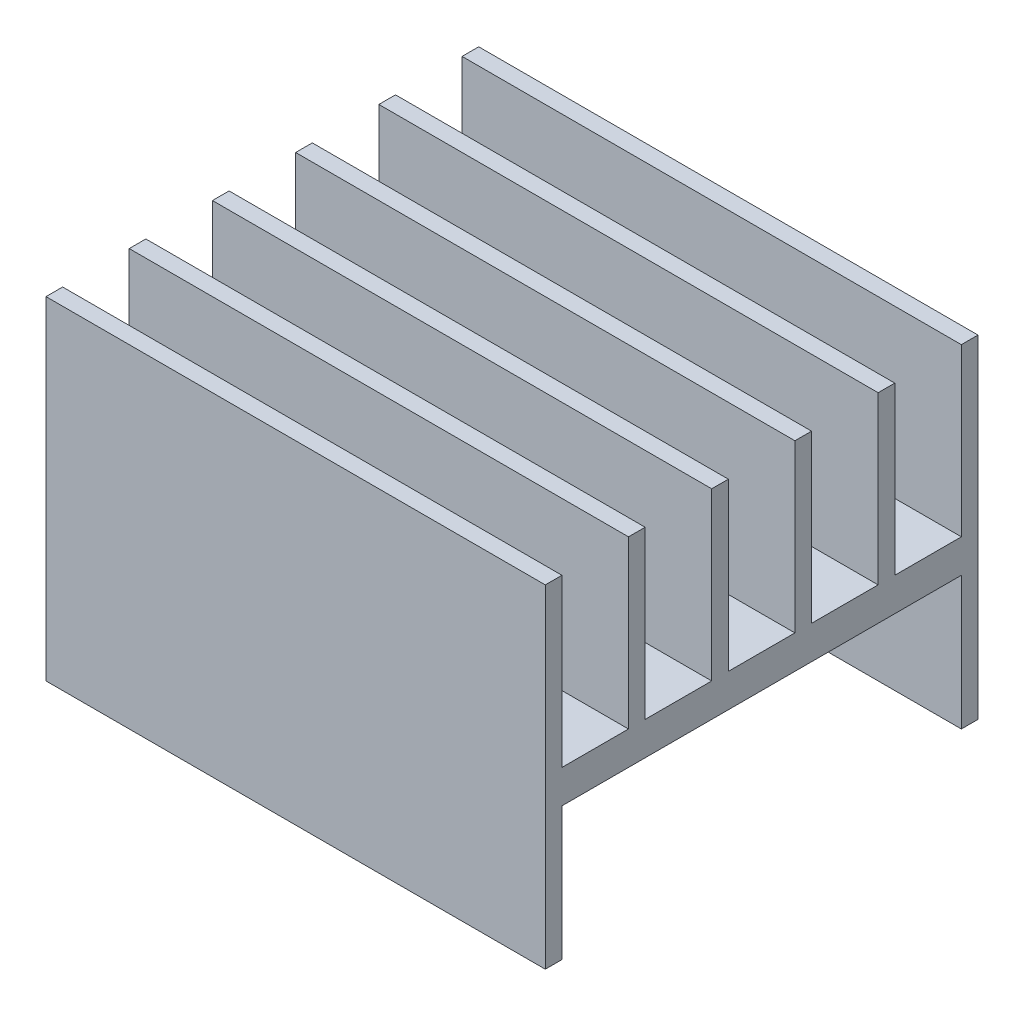
ISO-10303-21;
HEADER;
FILE_DESCRIPTION(('STEP AP214'),'2;1');
FILE_NAME('part.step','',(''),(''),'','','');
FILE_SCHEMA(('AUTOMOTIVE_DESIGN { 1 0 10303 214 1 1 1 1 }'));
ENDSEC;
DATA;
#1=APPLICATION_CONTEXT('core data for automotive mechanical design processes');
#2=APPLICATION_PROTOCOL_DEFINITION('international standard','automotive_design',2000,#1);
#3=PRODUCT_CONTEXT('',#1,'mechanical');
#4=PRODUCT('Part','Part','',(#3));
#5=PRODUCT_RELATED_PRODUCT_CATEGORY('part','',(#4));
#6=PRODUCT_DEFINITION_FORMATION('','',#4);
#7=PRODUCT_DEFINITION_CONTEXT('part definition',#1,'design');
#8=PRODUCT_DEFINITION('design','',#6,#7);
#9=PRODUCT_DEFINITION_SHAPE('','',#8);
#10=(LENGTH_UNIT() NAMED_UNIT(*) SI_UNIT(.MILLI.,.METRE.));
#11=(NAMED_UNIT(*) PLANE_ANGLE_UNIT() SI_UNIT($,.RADIAN.));
#12=(NAMED_UNIT(*) SI_UNIT($,.STERADIAN.) SOLID_ANGLE_UNIT());
#13=UNCERTAINTY_MEASURE_WITH_UNIT(LENGTH_MEASURE(1.E-05),#10,'distance_accuracy_value','');
#14=(GEOMETRIC_REPRESENTATION_CONTEXT(3) GLOBAL_UNCERTAINTY_ASSIGNED_CONTEXT((#13)) GLOBAL_UNIT_ASSIGNED_CONTEXT((#10,
#11,#12)) REPRESENTATION_CONTEXT('',''));
#15=CARTESIAN_POINT('',(0.,0.,0.));
#16=DIRECTION('',(0.,0.,1.));
#17=DIRECTION('',(1.,0.,0.));
#18=AXIS2_PLACEMENT_3D('',#15,#16,#17);
#19=CARTESIAN_POINT('',(30.,0.,1.99999999999999));
#20=DIRECTION('',(0.,0.,1.));
#21=DIRECTION('',(1.,0.,0.));
#22=AXIS2_PLACEMENT_3D('',#19,#20,#21);
#23=PLANE('',#22);
#24=DIRECTION('',(0.,1.,0.));
#25=VECTOR('',#24,1.);
#26=CARTESIAN_POINT('',(0.,0.,1.99999999999999));
#27=LINE('',#26,#25);
#28=CARTESIAN_POINT('',(0.,0.,1.99999999999999));
#29=VERTEX_POINT('',#28);
#30=CARTESIAN_POINT('',(0.,10.,1.99999999999999));
#31=VERTEX_POINT('',#30);
#32=EDGE_CURVE('E251',#29,#31,#27,.T.);
#33=ORIENTED_EDGE('',*,*,#32,.T.);
#34=DIRECTION('',(-1.,0.,0.));
#35=VECTOR('',#34,1.);
#36=CARTESIAN_POINT('',(30.,10.,1.99999999999999));
#37=LINE('',#36,#35);
#38=CARTESIAN_POINT('',(30.,10.,1.99999999999999));
#39=VERTEX_POINT('',#38);
#40=EDGE_CURVE('E11',#39,#31,#37,.T.);
#41=ORIENTED_EDGE('',*,*,#40,.F.);
#42=DIRECTION('',(0.,1.,0.));
#43=VECTOR('',#42,1.);
#44=CARTESIAN_POINT('',(30.,0.,1.99999999999999));
#45=LINE('',#44,#43);
#46=CARTESIAN_POINT('',(30.,0.,1.99999999999999));
#47=VERTEX_POINT('',#46);
#48=EDGE_CURVE('E305',#47,#39,#45,.T.);
#49=ORIENTED_EDGE('',*,*,#48,.F.);
#50=DIRECTION('',(-1.,0.,0.));
#51=VECTOR('',#50,1.);
#52=CARTESIAN_POINT('',(30.,0.,1.99999999999999));
#53=LINE('',#52,#51);
#54=EDGE_CURVE('E247',#47,#29,#53,.T.);
#55=ORIENTED_EDGE('',*,*,#54,.T.);
#56=EDGE_LOOP('',(#33,#41,#49,#55));
#57=FACE_BOUND('',#56,.T.);
#58=ADVANCED_FACE('F35',(#57),#23,.F.);
#59=CARTESIAN_POINT('',(30.,10.,1.99999999999999));
#60=DIRECTION('',(0.,-1.,0.));
#61=DIRECTION('',(0.,0.,-1.));
#62=AXIS2_PLACEMENT_3D('',#59,#60,#61);
#63=PLANE('',#62);
#64=DIRECTION('',(0.,0.,1.));
#65=VECTOR('',#64,1.);
#66=CARTESIAN_POINT('',(0.,10.,1.99999999999999));
#67=LINE('',#66,#65);
#68=CARTESIAN_POINT('',(0.,10.,2.99999999999999));
#69=VERTEX_POINT('',#68);
#70=EDGE_CURVE('E254',#31,#69,#67,.T.);
#71=ORIENTED_EDGE('',*,*,#70,.T.);
#72=DIRECTION('',(-1.,0.,0.));
#73=VECTOR('',#72,1.);
#74=CARTESIAN_POINT('',(30.,10.,2.99999999999999));
#75=LINE('',#74,#73);
#76=CARTESIAN_POINT('',(30.,10.,2.99999999999999));
#77=VERTEX_POINT('',#76);
#78=EDGE_CURVE('E43',#77,#69,#75,.T.);
#79=ORIENTED_EDGE('',*,*,#78,.F.);
#80=DIRECTION('',(0.,0.,1.));
#81=VECTOR('',#80,1.);
#82=CARTESIAN_POINT('',(30.,10.,1.99999999999999));
#83=LINE('',#82,#81);
#84=EDGE_CURVE('E154',#39,#77,#83,.T.);
#85=ORIENTED_EDGE('',*,*,#84,.F.);
#86=ORIENTED_EDGE('',*,*,#40,.T.);
#87=EDGE_LOOP('',(#71,#79,#85,#86));
#88=FACE_BOUND('',#87,.T.);
#89=ADVANCED_FACE('F463',(#88),#63,.F.);
#90=CARTESIAN_POINT('',(30.,10.,2.99999999999999));
#91=DIRECTION('',(0.,0.,-1.));
#92=DIRECTION('',(0.,1.,0.));
#93=AXIS2_PLACEMENT_3D('',#90,#91,#92);
#94=PLANE('',#93);
#95=DIRECTION('',(0.,-1.,0.));
#96=VECTOR('',#95,1.);
#97=CARTESIAN_POINT('',(0.,10.,2.99999999999999));
#98=LINE('',#97,#96);
#99=CARTESIAN_POINT('',(0.,0.,2.99999999999999));
#100=VERTEX_POINT('',#99);
#101=EDGE_CURVE('E256',#69,#100,#98,.T.);
#102=ORIENTED_EDGE('',*,*,#101,.T.);
#103=DIRECTION('',(-1.,0.,0.));
#104=VECTOR('',#103,1.);
#105=CARTESIAN_POINT('',(30.,0.,2.99999999999999));
#106=LINE('',#105,#104);
#107=CARTESIAN_POINT('',(30.,0.,2.99999999999999));
#108=VERTEX_POINT('',#107);
#109=EDGE_CURVE('E372',#108,#100,#106,.T.);
#110=ORIENTED_EDGE('',*,*,#109,.F.);
#111=DIRECTION('',(0.,-1.,0.));
#112=VECTOR('',#111,1.);
#113=CARTESIAN_POINT('',(30.,10.,2.99999999999999));
#114=LINE('',#113,#112);
#115=EDGE_CURVE('E380',#77,#108,#114,.T.);
#116=ORIENTED_EDGE('',*,*,#115,.F.);
#117=ORIENTED_EDGE('',*,*,#78,.T.);
#118=EDGE_LOOP('',(#102,#110,#116,#117));
#119=FACE_BOUND('',#118,.T.);
#120=ADVANCED_FACE('F378',(#119),#94,.F.);
#121=CARTESIAN_POINT('',(30.,0.,2.99999999999999));
#122=DIRECTION('',(0.,-1.,0.));
#123=DIRECTION('',(0.,0.,-1.));
#124=AXIS2_PLACEMENT_3D('',#121,#122,#123);
#125=PLANE('',#124);
#126=DIRECTION('',(0.,0.,1.));
#127=VECTOR('',#126,1.);
#128=CARTESIAN_POINT('',(0.,0.,2.99999999999999));
#129=LINE('',#128,#127);
#130=CARTESIAN_POINT('',(0.,0.,6.99999999999999));
#131=VERTEX_POINT('',#130);
#132=EDGE_CURVE('E258',#100,#131,#129,.T.);
#133=ORIENTED_EDGE('',*,*,#132,.T.);
#134=DIRECTION('',(-1.,0.,0.));
#135=VECTOR('',#134,1.);
#136=CARTESIAN_POINT('',(30.,0.,6.99999999999999));
#137=LINE('',#136,#135);
#138=CARTESIAN_POINT('',(30.,0.,6.99999999999999));
#139=VERTEX_POINT('',#138);
#140=EDGE_CURVE('E369',#139,#131,#137,.T.);
#141=ORIENTED_EDGE('',*,*,#140,.F.);
#142=DIRECTION('',(0.,0.,1.));
#143=VECTOR('',#142,1.);
#144=CARTESIAN_POINT('',(30.,0.,2.99999999999999));
#145=LINE('',#144,#143);
#146=EDGE_CURVE('E398',#108,#139,#145,.T.);
#147=ORIENTED_EDGE('',*,*,#146,.F.);
#148=ORIENTED_EDGE('',*,*,#109,.T.);
#149=EDGE_LOOP('',(#133,#141,#147,#148));
#150=FACE_BOUND('',#149,.T.);
#151=ADVANCED_FACE('F389',(#150),#125,.F.);
#152=CARTESIAN_POINT('',(30.,0.,6.99999999999999));
#153=DIRECTION('',(0.,0.,1.));
#154=DIRECTION('',(1.,0.,0.));
#155=AXIS2_PLACEMENT_3D('',#152,#153,#154);
#156=PLANE('',#155);
#157=DIRECTION('',(0.,1.,0.));
#158=VECTOR('',#157,1.);
#159=CARTESIAN_POINT('',(0.,0.,6.99999999999999));
#160=LINE('',#159,#158);
#161=CARTESIAN_POINT('',(0.,10.,6.99999999999999));
#162=VERTEX_POINT('',#161);
#163=EDGE_CURVE('E260',#131,#162,#160,.T.);
#164=ORIENTED_EDGE('',*,*,#163,.T.);
#165=DIRECTION('',(-1.,0.,0.));
#166=VECTOR('',#165,1.);
#167=CARTESIAN_POINT('',(30.,10.,6.99999999999999));
#168=LINE('',#167,#166);
#169=CARTESIAN_POINT('',(30.,10.,6.99999999999999));
#170=VERTEX_POINT('',#169);
#171=EDGE_CURVE('E366',#170,#162,#168,.T.);
#172=ORIENTED_EDGE('',*,*,#171,.F.);
#173=DIRECTION('',(0.,1.,0.));
#174=VECTOR('',#173,1.);
#175=CARTESIAN_POINT('',(30.,0.,6.99999999999999));
#176=LINE('',#175,#174);
#177=EDGE_CURVE('E395',#139,#170,#176,.T.);
#178=ORIENTED_EDGE('',*,*,#177,.F.);
#179=ORIENTED_EDGE('',*,*,#140,.T.);
#180=EDGE_LOOP('',(#164,#172,#178,#179));
#181=FACE_BOUND('',#180,.T.);
#182=ADVANCED_FACE('F393',(#181),#156,.F.);
#183=CARTESIAN_POINT('',(30.,10.,6.99999999999999));
#184=DIRECTION('',(0.,-1.,0.));
#185=DIRECTION('',(0.,0.,-1.));
#186=AXIS2_PLACEMENT_3D('',#183,#184,#185);
#187=PLANE('',#186);
#188=DIRECTION('',(0.,0.,1.));
#189=VECTOR('',#188,1.);
#190=CARTESIAN_POINT('',(0.,10.,6.99999999999999));
#191=LINE('',#190,#189);
#192=CARTESIAN_POINT('',(0.,10.,7.99999999999999));
#193=VERTEX_POINT('',#192);
#194=EDGE_CURVE('E262',#162,#193,#191,.T.);
#195=ORIENTED_EDGE('',*,*,#194,.T.);
#196=DIRECTION('',(-1.,0.,0.));
#197=VECTOR('',#196,1.);
#198=CARTESIAN_POINT('',(30.,10.,7.99999999999999));
#199=LINE('',#198,#197);
#200=CARTESIAN_POINT('',(30.,10.,7.99999999999999));
#201=VERTEX_POINT('',#200);
#202=EDGE_CURVE('E363',#201,#193,#199,.T.);
#203=ORIENTED_EDGE('',*,*,#202,.F.);
#204=DIRECTION('',(0.,0.,1.));
#205=VECTOR('',#204,1.);
#206=CARTESIAN_POINT('',(30.,10.,6.99999999999999));
#207=LINE('',#206,#205);
#208=EDGE_CURVE('E397',#170,#201,#207,.T.);
#209=ORIENTED_EDGE('',*,*,#208,.F.);
#210=ORIENTED_EDGE('',*,*,#171,.T.);
#211=EDGE_LOOP('',(#195,#203,#209,#210));
#212=FACE_BOUND('',#211,.T.);
#213=ADVANCED_FACE('F476',(#212),#187,.F.);
#214=CARTESIAN_POINT('',(30.,10.,7.99999999999999));
#215=DIRECTION('',(0.,0.,-1.));
#216=DIRECTION('',(0.,1.,0.));
#217=AXIS2_PLACEMENT_3D('',#214,#215,#216);
#218=PLANE('',#217);
#219=DIRECTION('',(0.,-1.,0.));
#220=VECTOR('',#219,1.);
#221=CARTESIAN_POINT('',(0.,10.,7.99999999999999));
#222=LINE('',#221,#220);
#223=CARTESIAN_POINT('',(0.,0.,7.99999999999999));
#224=VERTEX_POINT('',#223);
#225=EDGE_CURVE('E264',#193,#224,#222,.T.);
#226=ORIENTED_EDGE('',*,*,#225,.T.);
#227=DIRECTION('',(-1.,0.,0.));
#228=VECTOR('',#227,1.);
#229=CARTESIAN_POINT('',(30.,0.,7.99999999999999));
#230=LINE('',#229,#228);
#231=CARTESIAN_POINT('',(30.,0.,7.99999999999999));
#232=VERTEX_POINT('',#231);
#233=EDGE_CURVE('E360',#232,#224,#230,.T.);
#234=ORIENTED_EDGE('',*,*,#233,.F.);
#235=DIRECTION('',(0.,-1.,0.));
#236=VECTOR('',#235,1.);
#237=CARTESIAN_POINT('',(30.,10.,7.99999999999999));
#238=LINE('',#237,#236);
#239=EDGE_CURVE('E400',#201,#232,#238,.T.);
#240=ORIENTED_EDGE('',*,*,#239,.F.);
#241=ORIENTED_EDGE('',*,*,#202,.T.);
#242=EDGE_LOOP('',(#226,#234,#240,#241));
#243=FACE_BOUND('',#242,.T.);
#244=ADVANCED_FACE('F479',(#243),#218,.F.);
#245=CARTESIAN_POINT('',(30.,0.,7.99999999999999));
#246=DIRECTION('',(0.,-1.,0.));
#247=DIRECTION('',(0.,0.,-1.));
#248=AXIS2_PLACEMENT_3D('',#245,#246,#247);
#249=PLANE('',#248);
#250=DIRECTION('',(0.,0.,1.));
#251=VECTOR('',#250,1.);
#252=CARTESIAN_POINT('',(0.,0.,7.99999999999999));
#253=LINE('',#252,#251);
#254=CARTESIAN_POINT('',(0.,0.,12.));
#255=VERTEX_POINT('',#254);
#256=EDGE_CURVE('E266',#224,#255,#253,.T.);
#257=ORIENTED_EDGE('',*,*,#256,.T.);
#258=DIRECTION('',(-1.,0.,0.));
#259=VECTOR('',#258,1.);
#260=CARTESIAN_POINT('',(30.,0.,12.));
#261=LINE('',#260,#259);
#262=CARTESIAN_POINT('',(30.,0.,12.));
#263=VERTEX_POINT('',#262);
#264=EDGE_CURVE('E357',#263,#255,#261,.T.);
#265=ORIENTED_EDGE('',*,*,#264,.F.);
#266=DIRECTION('',(0.,0.,1.));
#267=VECTOR('',#266,1.);
#268=CARTESIAN_POINT('',(30.,0.,7.99999999999999));
#269=LINE('',#268,#267);
#270=EDGE_CURVE('E406',#232,#263,#269,.T.);
#271=ORIENTED_EDGE('',*,*,#270,.F.);
#272=ORIENTED_EDGE('',*,*,#233,.T.);
#273=EDGE_LOOP('',(#257,#265,#271,#272));
#274=FACE_BOUND('',#273,.T.);
#275=ADVANCED_FACE('F483',(#274),#249,.F.);
#276=CARTESIAN_POINT('',(30.,0.,12.));
#277=DIRECTION('',(0.,0.,1.));
#278=DIRECTION('',(1.,0.,0.));
#279=AXIS2_PLACEMENT_3D('',#276,#277,#278);
#280=PLANE('',#279);
#281=DIRECTION('',(0.,1.,0.));
#282=VECTOR('',#281,1.);
#283=CARTESIAN_POINT('',(0.,0.,12.));
#284=LINE('',#283,#282);
#285=CARTESIAN_POINT('',(0.,10.,12.));
#286=VERTEX_POINT('',#285);
#287=EDGE_CURVE('E268',#255,#286,#284,.T.);
#288=ORIENTED_EDGE('',*,*,#287,.T.);
#289=DIRECTION('',(-1.,0.,0.));
#290=VECTOR('',#289,1.);
#291=CARTESIAN_POINT('',(30.,10.,12.));
#292=LINE('',#291,#290);
#293=CARTESIAN_POINT('',(30.,10.,12.));
#294=VERTEX_POINT('',#293);
#295=EDGE_CURVE('E354',#294,#286,#292,.T.);
#296=ORIENTED_EDGE('',*,*,#295,.F.);
#297=DIRECTION('',(0.,1.,0.));
#298=VECTOR('',#297,1.);
#299=CARTESIAN_POINT('',(30.,0.,12.));
#300=LINE('',#299,#298);
#301=EDGE_CURVE('E408',#263,#294,#300,.T.);
#302=ORIENTED_EDGE('',*,*,#301,.F.);
#303=ORIENTED_EDGE('',*,*,#264,.T.);
#304=EDGE_LOOP('',(#288,#296,#302,#303));
#305=FACE_BOUND('',#304,.T.);
#306=ADVANCED_FACE('F487',(#305),#280,.F.);
#307=CARTESIAN_POINT('',(30.,10.,12.));
#308=DIRECTION('',(0.,-1.,0.));
#309=DIRECTION('',(0.,0.,-1.));
#310=AXIS2_PLACEMENT_3D('',#307,#308,#309);
#311=PLANE('',#310);
#312=DIRECTION('',(0.,0.,1.));
#313=VECTOR('',#312,1.);
#314=CARTESIAN_POINT('',(0.,10.,12.));
#315=LINE('',#314,#313);
#316=CARTESIAN_POINT('',(0.,10.,13.));
#317=VERTEX_POINT('',#316);
#318=EDGE_CURVE('E270',#286,#317,#315,.T.);
#319=ORIENTED_EDGE('',*,*,#318,.T.);
#320=DIRECTION('',(-1.,0.,0.));
#321=VECTOR('',#320,1.);
#322=CARTESIAN_POINT('',(30.,10.,13.));
#323=LINE('',#322,#321);
#324=CARTESIAN_POINT('',(30.,10.,13.));
#325=VERTEX_POINT('',#324);
#326=EDGE_CURVE('E351',#325,#317,#323,.T.);
#327=ORIENTED_EDGE('',*,*,#326,.F.);
#328=DIRECTION('',(0.,0.,1.));
#329=VECTOR('',#328,1.);
#330=CARTESIAN_POINT('',(30.,10.,12.));
#331=LINE('',#330,#329);
#332=EDGE_CURVE('E410',#294,#325,#331,.T.);
#333=ORIENTED_EDGE('',*,*,#332,.F.);
#334=ORIENTED_EDGE('',*,*,#295,.T.);
#335=EDGE_LOOP('',(#319,#327,#333,#334));
#336=FACE_BOUND('',#335,.T.);
#337=ADVANCED_FACE('F491',(#336),#311,.F.);
#338=CARTESIAN_POINT('',(30.,10.,13.));
#339=DIRECTION('',(0.,0.,-1.));
#340=DIRECTION('',(0.,1.,0.));
#341=AXIS2_PLACEMENT_3D('',#338,#339,#340);
#342=PLANE('',#341);
#343=DIRECTION('',(0.,-1.,0.));
#344=VECTOR('',#343,1.);
#345=CARTESIAN_POINT('',(0.,10.,13.));
#346=LINE('',#345,#344);
#347=CARTESIAN_POINT('',(0.,-10.,13.));
#348=VERTEX_POINT('',#347);
#349=EDGE_CURVE('E272',#317,#348,#346,.T.);
#350=ORIENTED_EDGE('',*,*,#349,.T.);
#351=DIRECTION('',(-1.,0.,0.));
#352=VECTOR('',#351,1.);
#353=CARTESIAN_POINT('',(30.,-10.,13.));
#354=LINE('',#353,#352);
#355=CARTESIAN_POINT('',(30.,-10.,13.));
#356=VERTEX_POINT('',#355);
#357=EDGE_CURVE('E348',#356,#348,#354,.T.);
#358=ORIENTED_EDGE('',*,*,#357,.F.);
#359=DIRECTION('',(0.,-1.,0.));
#360=VECTOR('',#359,1.);
#361=CARTESIAN_POINT('',(30.,10.,13.));
#362=LINE('',#361,#360);
#363=EDGE_CURVE('E412',#325,#356,#362,.T.);
#364=ORIENTED_EDGE('',*,*,#363,.F.);
#365=ORIENTED_EDGE('',*,*,#326,.T.);
#366=EDGE_LOOP('',(#350,#358,#364,#365));
#367=FACE_BOUND('',#366,.T.);
#368=ADVANCED_FACE('F495',(#367),#342,.F.);
#369=CARTESIAN_POINT('',(30.,-10.,13.));
#370=DIRECTION('',(0.,1.,0.));
#371=DIRECTION('',(0.,0.,1.));
#372=AXIS2_PLACEMENT_3D('',#369,#370,#371);
#373=PLANE('',#372);
#374=DIRECTION('',(0.,0.,-1.));
#375=VECTOR('',#374,1.);
#376=CARTESIAN_POINT('',(0.,-10.,13.));
#377=LINE('',#376,#375);
#378=CARTESIAN_POINT('',(0.,-10.,12.));
#379=VERTEX_POINT('',#378);
#380=EDGE_CURVE('E274',#348,#379,#377,.T.);
#381=ORIENTED_EDGE('',*,*,#380,.T.);
#382=DIRECTION('',(-1.,0.,0.));
#383=VECTOR('',#382,1.);
#384=CARTESIAN_POINT('',(30.,-10.,12.));
#385=LINE('',#384,#383);
#386=CARTESIAN_POINT('',(30.,-10.,12.));
#387=VERTEX_POINT('',#386);
#388=EDGE_CURVE('E345',#387,#379,#385,.T.);
#389=ORIENTED_EDGE('',*,*,#388,.F.);
#390=DIRECTION('',(0.,0.,-1.));
#391=VECTOR('',#390,1.);
#392=CARTESIAN_POINT('',(30.,-10.,13.));
#393=LINE('',#392,#391);
#394=EDGE_CURVE('E414',#356,#387,#393,.T.);
#395=ORIENTED_EDGE('',*,*,#394,.F.);
#396=ORIENTED_EDGE('',*,*,#357,.T.);
#397=EDGE_LOOP('',(#381,#389,#395,#396));
#398=FACE_BOUND('',#397,.T.);
#399=ADVANCED_FACE('F499',(#398),#373,.F.);
#400=CARTESIAN_POINT('',(30.,-10.,12.));
#401=DIRECTION('',(0.,0.,1.));
#402=DIRECTION('',(1.,0.,0.));
#403=AXIS2_PLACEMENT_3D('',#400,#401,#402);
#404=PLANE('',#403);
#405=DIRECTION('',(0.,1.,0.));
#406=VECTOR('',#405,1.);
#407=CARTESIAN_POINT('',(0.,-10.,12.));
#408=LINE('',#407,#406);
#409=CARTESIAN_POINT('',(0.,-2.,12.));
#410=VERTEX_POINT('',#409);
#411=EDGE_CURVE('E276',#379,#410,#408,.T.);
#412=ORIENTED_EDGE('',*,*,#411,.T.);
#413=DIRECTION('',(-1.,0.,0.));
#414=VECTOR('',#413,1.);
#415=CARTESIAN_POINT('',(30.,-2.,12.));
#416=LINE('',#415,#414);
#417=CARTESIAN_POINT('',(30.,-2.,12.));
#418=VERTEX_POINT('',#417);
#419=EDGE_CURVE('E342',#418,#410,#416,.T.);
#420=ORIENTED_EDGE('',*,*,#419,.F.);
#421=DIRECTION('',(0.,1.,0.));
#422=VECTOR('',#421,1.);
#423=CARTESIAN_POINT('',(30.,-10.,12.));
#424=LINE('',#423,#422);
#425=EDGE_CURVE('E416',#387,#418,#424,.T.);
#426=ORIENTED_EDGE('',*,*,#425,.F.);
#427=ORIENTED_EDGE('',*,*,#388,.T.);
#428=EDGE_LOOP('',(#412,#420,#426,#427));
#429=FACE_BOUND('',#428,.T.);
#430=ADVANCED_FACE('F503',(#429),#404,.F.);
#431=CARTESIAN_POINT('',(30.,-2.,12.));
#432=DIRECTION('',(0.,1.,0.));
#433=DIRECTION('',(0.,0.,1.));
#434=AXIS2_PLACEMENT_3D('',#431,#432,#433);
#435=PLANE('',#434);
#436=DIRECTION('',(0.,0.,-1.));
#437=VECTOR('',#436,1.);
#438=CARTESIAN_POINT('',(0.,-2.,12.));
#439=LINE('',#438,#437);
#440=CARTESIAN_POINT('',(0.,-2.,-12.));
#441=VERTEX_POINT('',#440);
#442=EDGE_CURVE('E278',#410,#441,#439,.T.);
#443=ORIENTED_EDGE('',*,*,#442,.T.);
#444=DIRECTION('',(-1.,0.,0.));
#445=VECTOR('',#444,1.);
#446=CARTESIAN_POINT('',(30.,-2.,-12.));
#447=LINE('',#446,#445);
#448=CARTESIAN_POINT('',(30.,-2.,-12.));
#449=VERTEX_POINT('',#448);
#450=EDGE_CURVE('E339',#449,#441,#447,.T.);
#451=ORIENTED_EDGE('',*,*,#450,.F.);
#452=DIRECTION('',(0.,0.,-1.));
#453=VECTOR('',#452,1.);
#454=CARTESIAN_POINT('',(30.,-2.,12.));
#455=LINE('',#454,#453);
#456=EDGE_CURVE('E418',#418,#449,#455,.T.);
#457=ORIENTED_EDGE('',*,*,#456,.F.);
#458=ORIENTED_EDGE('',*,*,#419,.T.);
#459=EDGE_LOOP('',(#443,#451,#457,#458));
#460=FACE_BOUND('',#459,.T.);
#461=ADVANCED_FACE('F507',(#460),#435,.F.);
#462=CARTESIAN_POINT('',(30.,-10.,-12.));
#463=DIRECTION('',(0.,0.,-1.));
#464=DIRECTION('',(-1.,0.,0.));
#465=AXIS2_PLACEMENT_3D('',#462,#463,#464);
#466=PLANE('',#465);
#467=DIRECTION('',(0.,-1.,0.));
#468=VECTOR('',#467,1.);
#469=CARTESIAN_POINT('',(0.,-10.,-12.));
#470=LINE('',#469,#468);
#471=CARTESIAN_POINT('',(0.,-10.,-12.));
#472=VERTEX_POINT('',#471);
#473=EDGE_CURVE('E280',#441,#472,#470,.T.);
#474=ORIENTED_EDGE('',*,*,#473,.T.);
#475=DIRECTION('',(-1.,0.,0.));
#476=VECTOR('',#475,1.);
#477=CARTESIAN_POINT('',(30.,-10.,-12.));
#478=LINE('',#477,#476);
#479=CARTESIAN_POINT('',(30.,-10.,-12.));
#480=VERTEX_POINT('',#479);
#481=EDGE_CURVE('E336',#480,#472,#478,.T.);
#482=ORIENTED_EDGE('',*,*,#481,.F.);
#483=DIRECTION('',(0.,-1.,0.));
#484=VECTOR('',#483,1.);
#485=CARTESIAN_POINT('',(30.,-10.,-12.));
#486=LINE('',#485,#484);
#487=EDGE_CURVE('E420',#449,#480,#486,.T.);
#488=ORIENTED_EDGE('',*,*,#487,.F.);
#489=ORIENTED_EDGE('',*,*,#450,.T.);
#490=EDGE_LOOP('',(#474,#482,#488,#489));
#491=FACE_BOUND('',#490,.T.);
#492=ADVANCED_FACE('F511',(#491),#466,.F.);
#493=CARTESIAN_POINT('',(30.,-10.,-13.));
#494=DIRECTION('',(0.,1.,0.));
#495=DIRECTION('',(0.,0.,1.));
#496=AXIS2_PLACEMENT_3D('',#493,#494,#495);
#497=PLANE('',#496);
#498=DIRECTION('',(0.,0.,-1.));
#499=VECTOR('',#498,1.);
#500=CARTESIAN_POINT('',(0.,-10.,-13.));
#501=LINE('',#500,#499);
#502=CARTESIAN_POINT('',(0.,-10.,-13.));
#503=VERTEX_POINT('',#502);
#504=EDGE_CURVE('E282',#472,#503,#501,.T.);
#505=ORIENTED_EDGE('',*,*,#504,.T.);
#506=DIRECTION('',(-1.,0.,0.));
#507=VECTOR('',#506,1.);
#508=CARTESIAN_POINT('',(30.,-10.,-13.));
#509=LINE('',#508,#507);
#510=CARTESIAN_POINT('',(30.,-10.,-13.));
#511=VERTEX_POINT('',#510);
#512=EDGE_CURVE('E333',#511,#503,#509,.T.);
#513=ORIENTED_EDGE('',*,*,#512,.F.);
#514=DIRECTION('',(0.,0.,-1.));
#515=VECTOR('',#514,1.);
#516=CARTESIAN_POINT('',(30.,-10.,-13.));
#517=LINE('',#516,#515);
#518=EDGE_CURVE('E422',#480,#511,#517,.T.);
#519=ORIENTED_EDGE('',*,*,#518,.F.);
#520=ORIENTED_EDGE('',*,*,#481,.T.);
#521=EDGE_LOOP('',(#505,#513,#519,#520));
#522=FACE_BOUND('',#521,.T.);
#523=ADVANCED_FACE('F515',(#522),#497,.F.);
#524=CARTESIAN_POINT('',(30.,10.,-13.));
#525=DIRECTION('',(0.,0.,1.));
#526=DIRECTION('',(0.,-1.,0.));
#527=AXIS2_PLACEMENT_3D('',#524,#525,#526);
#528=PLANE('',#527);
#529=DIRECTION('',(0.,1.,0.));
#530=VECTOR('',#529,1.);
#531=CARTESIAN_POINT('',(0.,10.,-13.));
#532=LINE('',#531,#530);
#533=CARTESIAN_POINT('',(0.,10.,-13.));
#534=VERTEX_POINT('',#533);
#535=EDGE_CURVE('E284',#503,#534,#532,.T.);
#536=ORIENTED_EDGE('',*,*,#535,.T.);
#537=DIRECTION('',(-1.,0.,0.));
#538=VECTOR('',#537,1.);
#539=CARTESIAN_POINT('',(30.,10.,-13.));
#540=LINE('',#539,#538);
#541=CARTESIAN_POINT('',(30.,10.,-13.));
#542=VERTEX_POINT('',#541);
#543=EDGE_CURVE('E330',#542,#534,#540,.T.);
#544=ORIENTED_EDGE('',*,*,#543,.F.);
#545=DIRECTION('',(0.,1.,0.));
#546=VECTOR('',#545,1.);
#547=CARTESIAN_POINT('',(30.,10.,-13.));
#548=LINE('',#547,#546);
#549=EDGE_CURVE('E424',#511,#542,#548,.T.);
#550=ORIENTED_EDGE('',*,*,#549,.F.);
#551=ORIENTED_EDGE('',*,*,#512,.T.);
#552=EDGE_LOOP('',(#536,#544,#550,#551));
#553=FACE_BOUND('',#552,.T.);
#554=ADVANCED_FACE('F519',(#553),#528,.F.);
#555=CARTESIAN_POINT('',(30.,10.,-12.));
#556=DIRECTION('',(0.,-1.,0.));
#557=DIRECTION('',(0.,0.,-1.));
#558=AXIS2_PLACEMENT_3D('',#555,#556,#557);
#559=PLANE('',#558);
#560=DIRECTION('',(0.,0.,1.));
#561=VECTOR('',#560,1.);
#562=CARTESIAN_POINT('',(0.,10.,-12.));
#563=LINE('',#562,#561);
#564=CARTESIAN_POINT('',(0.,10.,-12.));
#565=VERTEX_POINT('',#564);
#566=EDGE_CURVE('E286',#534,#565,#563,.T.);
#567=ORIENTED_EDGE('',*,*,#566,.T.);
#568=DIRECTION('',(-1.,0.,0.));
#569=VECTOR('',#568,1.);
#570=CARTESIAN_POINT('',(30.,10.,-12.));
#571=LINE('',#570,#569);
#572=CARTESIAN_POINT('',(30.,10.,-12.));
#573=VERTEX_POINT('',#572);
#574=EDGE_CURVE('E327',#573,#565,#571,.T.);
#575=ORIENTED_EDGE('',*,*,#574,.F.);
#576=DIRECTION('',(0.,0.,1.));
#577=VECTOR('',#576,1.);
#578=CARTESIAN_POINT('',(30.,10.,-12.));
#579=LINE('',#578,#577);
#580=EDGE_CURVE('E426',#542,#573,#579,.T.);
#581=ORIENTED_EDGE('',*,*,#580,.F.);
#582=ORIENTED_EDGE('',*,*,#543,.T.);
#583=EDGE_LOOP('',(#567,#575,#581,#582));
#584=FACE_BOUND('',#583,.T.);
#585=ADVANCED_FACE('F523',(#584),#559,.F.);
#586=CARTESIAN_POINT('',(30.,0.,-12.));
#587=DIRECTION('',(0.,0.,-1.));
#588=DIRECTION('',(0.,1.,0.));
#589=AXIS2_PLACEMENT_3D('',#586,#587,#588);
#590=PLANE('',#589);
#591=DIRECTION('',(0.,-1.,0.));
#592=VECTOR('',#591,1.);
#593=CARTESIAN_POINT('',(0.,0.,-12.));
#594=LINE('',#593,#592);
#595=CARTESIAN_POINT('',(0.,0.,-12.));
#596=VERTEX_POINT('',#595);
#597=EDGE_CURVE('E288',#565,#596,#594,.T.);
#598=ORIENTED_EDGE('',*,*,#597,.T.);
#599=DIRECTION('',(-1.,0.,0.));
#600=VECTOR('',#599,1.);
#601=CARTESIAN_POINT('',(30.,0.,-12.));
#602=LINE('',#601,#600);
#603=CARTESIAN_POINT('',(30.,0.,-12.));
#604=VERTEX_POINT('',#603);
#605=EDGE_CURVE('E324',#604,#596,#602,.T.);
#606=ORIENTED_EDGE('',*,*,#605,.F.);
#607=DIRECTION('',(0.,-1.,0.));
#608=VECTOR('',#607,1.);
#609=CARTESIAN_POINT('',(30.,0.,-12.));
#610=LINE('',#609,#608);
#611=EDGE_CURVE('E428',#573,#604,#610,.T.);
#612=ORIENTED_EDGE('',*,*,#611,.F.);
#613=ORIENTED_EDGE('',*,*,#574,.T.);
#614=EDGE_LOOP('',(#598,#606,#612,#613));
#615=FACE_BOUND('',#614,.T.);
#616=ADVANCED_FACE('F527',(#615),#590,.F.);
#617=CARTESIAN_POINT('',(30.,0.,-8.00000000000001));
#618=DIRECTION('',(0.,-1.,0.));
#619=DIRECTION('',(0.,0.,-1.));
#620=AXIS2_PLACEMENT_3D('',#617,#618,#619);
#621=PLANE('',#620);
#622=DIRECTION('',(0.,0.,1.));
#623=VECTOR('',#622,1.);
#624=CARTESIAN_POINT('',(0.,0.,-8.00000000000001));
#625=LINE('',#624,#623);
#626=CARTESIAN_POINT('',(0.,0.,-8.00000000000001));
#627=VERTEX_POINT('',#626);
#628=EDGE_CURVE('E290',#596,#627,#625,.T.);
#629=ORIENTED_EDGE('',*,*,#628,.T.);
#630=DIRECTION('',(-1.,0.,0.));
#631=VECTOR('',#630,1.);
#632=CARTESIAN_POINT('',(30.,0.,-8.00000000000001));
#633=LINE('',#632,#631);
#634=CARTESIAN_POINT('',(30.,0.,-8.00000000000001));
#635=VERTEX_POINT('',#634);
#636=EDGE_CURVE('E321',#635,#627,#633,.T.);
#637=ORIENTED_EDGE('',*,*,#636,.F.);
#638=DIRECTION('',(0.,0.,1.));
#639=VECTOR('',#638,1.);
#640=CARTESIAN_POINT('',(30.,0.,-8.00000000000001));
#641=LINE('',#640,#639);
#642=EDGE_CURVE('E430',#604,#635,#641,.T.);
#643=ORIENTED_EDGE('',*,*,#642,.F.);
#644=ORIENTED_EDGE('',*,*,#605,.T.);
#645=EDGE_LOOP('',(#629,#637,#643,#644));
#646=FACE_BOUND('',#645,.T.);
#647=ADVANCED_FACE('F531',(#646),#621,.F.);
#648=CARTESIAN_POINT('',(30.,10.,-8.00000000000001));
#649=DIRECTION('',(0.,0.,1.));
#650=DIRECTION('',(0.,-1.,0.));
#651=AXIS2_PLACEMENT_3D('',#648,#649,#650);
#652=PLANE('',#651);
#653=DIRECTION('',(0.,1.,0.));
#654=VECTOR('',#653,1.);
#655=CARTESIAN_POINT('',(0.,10.,-8.00000000000001));
#656=LINE('',#655,#654);
#657=CARTESIAN_POINT('',(0.,10.,-8.00000000000001));
#658=VERTEX_POINT('',#657);
#659=EDGE_CURVE('E292',#627,#658,#656,.T.);
#660=ORIENTED_EDGE('',*,*,#659,.T.);
#661=DIRECTION('',(-1.,0.,0.));
#662=VECTOR('',#661,1.);
#663=CARTESIAN_POINT('',(30.,10.,-8.00000000000001));
#664=LINE('',#663,#662);
#665=CARTESIAN_POINT('',(30.,10.,-8.00000000000001));
#666=VERTEX_POINT('',#665);
#667=EDGE_CURVE('E318',#666,#658,#664,.T.);
#668=ORIENTED_EDGE('',*,*,#667,.F.);
#669=DIRECTION('',(0.,1.,0.));
#670=VECTOR('',#669,1.);
#671=CARTESIAN_POINT('',(30.,10.,-8.00000000000001));
#672=LINE('',#671,#670);
#673=EDGE_CURVE('E432',#635,#666,#672,.T.);
#674=ORIENTED_EDGE('',*,*,#673,.F.);
#675=ORIENTED_EDGE('',*,*,#636,.T.);
#676=EDGE_LOOP('',(#660,#668,#674,#675));
#677=FACE_BOUND('',#676,.T.);
#678=ADVANCED_FACE('F535',(#677),#652,.F.);
#679=CARTESIAN_POINT('',(30.,10.,-7.));
#680=DIRECTION('',(0.,-1.,0.));
#681=DIRECTION('',(0.,0.,-1.));
#682=AXIS2_PLACEMENT_3D('',#679,#680,#681);
#683=PLANE('',#682);
#684=DIRECTION('',(0.,0.,1.));
#685=VECTOR('',#684,1.);
#686=CARTESIAN_POINT('',(0.,10.,-7.));
#687=LINE('',#686,#685);
#688=CARTESIAN_POINT('',(0.,10.,-7.));
#689=VERTEX_POINT('',#688);
#690=EDGE_CURVE('E294',#658,#689,#687,.T.);
#691=ORIENTED_EDGE('',*,*,#690,.T.);
#692=DIRECTION('',(-1.,0.,0.));
#693=VECTOR('',#692,1.);
#694=CARTESIAN_POINT('',(30.,10.,-7.));
#695=LINE('',#694,#693);
#696=CARTESIAN_POINT('',(30.,10.,-7.));
#697=VERTEX_POINT('',#696);
#698=EDGE_CURVE('E315',#697,#689,#695,.T.);
#699=ORIENTED_EDGE('',*,*,#698,.F.);
#700=DIRECTION('',(0.,0.,1.));
#701=VECTOR('',#700,1.);
#702=CARTESIAN_POINT('',(30.,10.,-7.));
#703=LINE('',#702,#701);
#704=EDGE_CURVE('E434',#666,#697,#703,.T.);
#705=ORIENTED_EDGE('',*,*,#704,.F.);
#706=ORIENTED_EDGE('',*,*,#667,.T.);
#707=EDGE_LOOP('',(#691,#699,#705,#706));
#708=FACE_BOUND('',#707,.T.);
#709=ADVANCED_FACE('F539',(#708),#683,.F.);
#710=CARTESIAN_POINT('',(30.,0.,-7.00000000000001));
#711=DIRECTION('',(0.,0.,-1.));
#712=DIRECTION('',(0.,1.,0.));
#713=AXIS2_PLACEMENT_3D('',#710,#711,#712);
#714=PLANE('',#713);
#715=DIRECTION('',(0.,-1.,0.));
#716=VECTOR('',#715,1.);
#717=CARTESIAN_POINT('',(0.,0.,-7.00000000000001));
#718=LINE('',#717,#716);
#719=CARTESIAN_POINT('',(0.,0.,-7.00000000000001));
#720=VERTEX_POINT('',#719);
#721=EDGE_CURVE('E296',#689,#720,#718,.T.);
#722=ORIENTED_EDGE('',*,*,#721,.T.);
#723=DIRECTION('',(-1.,0.,0.));
#724=VECTOR('',#723,1.);
#725=CARTESIAN_POINT('',(30.,0.,-7.00000000000001));
#726=LINE('',#725,#724);
#727=CARTESIAN_POINT('',(30.,0.,-7.00000000000001));
#728=VERTEX_POINT('',#727);
#729=EDGE_CURVE('E312',#728,#720,#726,.T.);
#730=ORIENTED_EDGE('',*,*,#729,.F.);
#731=DIRECTION('',(0.,-1.,0.));
#732=VECTOR('',#731,1.);
#733=CARTESIAN_POINT('',(30.,0.,-7.00000000000001));
#734=LINE('',#733,#732);
#735=EDGE_CURVE('E436',#697,#728,#734,.T.);
#736=ORIENTED_EDGE('',*,*,#735,.F.);
#737=ORIENTED_EDGE('',*,*,#698,.T.);
#738=EDGE_LOOP('',(#722,#730,#736,#737));
#739=FACE_BOUND('',#738,.T.);
#740=ADVANCED_FACE('F543',(#739),#714,.F.);
#741=CARTESIAN_POINT('',(30.,0.,-3.00000000000001));
#742=DIRECTION('',(0.,-1.,0.));
#743=DIRECTION('',(0.,0.,-1.));
#744=AXIS2_PLACEMENT_3D('',#741,#742,#743);
#745=PLANE('',#744);
#746=DIRECTION('',(0.,0.,1.));
#747=VECTOR('',#746,1.);
#748=CARTESIAN_POINT('',(0.,0.,-3.00000000000001));
#749=LINE('',#748,#747);
#750=CARTESIAN_POINT('',(0.,0.,-3.00000000000001));
#751=VERTEX_POINT('',#750);
#752=EDGE_CURVE('E298',#720,#751,#749,.T.);
#753=ORIENTED_EDGE('',*,*,#752,.T.);
#754=DIRECTION('',(-1.,0.,0.));
#755=VECTOR('',#754,1.);
#756=CARTESIAN_POINT('',(30.,0.,-3.00000000000001));
#757=LINE('',#756,#755);
#758=CARTESIAN_POINT('',(30.,0.,-3.00000000000001));
#759=VERTEX_POINT('',#758);
#760=EDGE_CURVE('E309',#759,#751,#757,.T.);
#761=ORIENTED_EDGE('',*,*,#760,.F.);
#762=DIRECTION('',(0.,0.,1.));
#763=VECTOR('',#762,1.);
#764=CARTESIAN_POINT('',(30.,0.,-3.00000000000001));
#765=LINE('',#764,#763);
#766=EDGE_CURVE('E438',#728,#759,#765,.T.);
#767=ORIENTED_EDGE('',*,*,#766,.F.);
#768=ORIENTED_EDGE('',*,*,#729,.T.);
#769=EDGE_LOOP('',(#753,#761,#767,#768));
#770=FACE_BOUND('',#769,.T.);
#771=ADVANCED_FACE('F444',(#770),#745,.F.);
#772=CARTESIAN_POINT('',(30.,10.,-3.00000000000001));
#773=DIRECTION('',(0.,0.,1.));
#774=DIRECTION('',(0.,-1.,0.));
#775=AXIS2_PLACEMENT_3D('',#772,#773,#774);
#776=PLANE('',#775);
#777=DIRECTION('',(0.,1.,0.));
#778=VECTOR('',#777,1.);
#779=CARTESIAN_POINT('',(0.,10.,-3.00000000000001));
#780=LINE('',#779,#778);
#781=CARTESIAN_POINT('',(0.,10.,-3.00000000000001));
#782=VERTEX_POINT('',#781);
#783=EDGE_CURVE('E300',#751,#782,#780,.T.);
#784=ORIENTED_EDGE('',*,*,#783,.T.);
#785=DIRECTION('',(-1.,0.,0.));
#786=VECTOR('',#785,1.);
#787=CARTESIAN_POINT('',(30.,10.,-3.00000000000001));
#788=LINE('',#787,#786);
#789=CARTESIAN_POINT('',(30.,10.,-3.00000000000001));
#790=VERTEX_POINT('',#789);
#791=EDGE_CURVE('E242',#790,#782,#788,.T.);
#792=ORIENTED_EDGE('',*,*,#791,.F.);
#793=DIRECTION('',(0.,1.,0.));
#794=VECTOR('',#793,1.);
#795=CARTESIAN_POINT('',(30.,10.,-3.00000000000001));
#796=LINE('',#795,#794);
#797=EDGE_CURVE('E233',#759,#790,#796,.T.);
#798=ORIENTED_EDGE('',*,*,#797,.F.);
#799=ORIENTED_EDGE('',*,*,#760,.T.);
#800=EDGE_LOOP('',(#784,#792,#798,#799));
#801=FACE_BOUND('',#800,.T.);
#802=ADVANCED_FACE('F448',(#801),#776,.F.);
#803=CARTESIAN_POINT('',(30.,10.,-2.00000000000001));
#804=DIRECTION('',(0.,-1.,0.));
#805=DIRECTION('',(0.,0.,-1.));
#806=AXIS2_PLACEMENT_3D('',#803,#804,#805);
#807=PLANE('',#806);
#808=DIRECTION('',(0.,0.,1.));
#809=VECTOR('',#808,1.);
#810=CARTESIAN_POINT('',(0.,10.,-2.00000000000001));
#811=LINE('',#810,#809);
#812=CARTESIAN_POINT('',(0.,10.,-2.00000000000001));
#813=VERTEX_POINT('',#812);
#814=EDGE_CURVE('E241',#782,#813,#811,.T.);
#815=ORIENTED_EDGE('',*,*,#814,.T.);
#816=DIRECTION('',(-1.,0.,0.));
#817=VECTOR('',#816,1.);
#818=CARTESIAN_POINT('',(30.,10.,-2.00000000000001));
#819=LINE('',#818,#817);
#820=CARTESIAN_POINT('',(30.,10.,-2.00000000000001));
#821=VERTEX_POINT('',#820);
#822=EDGE_CURVE('E238',#821,#813,#819,.T.);
#823=ORIENTED_EDGE('',*,*,#822,.F.);
#824=DIRECTION('',(0.,0.,1.));
#825=VECTOR('',#824,1.);
#826=CARTESIAN_POINT('',(30.,10.,-2.00000000000001));
#827=LINE('',#826,#825);
#828=EDGE_CURVE('E227',#790,#821,#827,.T.);
#829=ORIENTED_EDGE('',*,*,#828,.F.);
#830=ORIENTED_EDGE('',*,*,#791,.T.);
#831=EDGE_LOOP('',(#815,#823,#829,#830));
#832=FACE_BOUND('',#831,.T.);
#833=ADVANCED_FACE('F239',(#832),#807,.F.);
#834=CARTESIAN_POINT('',(30.,0.,-2.00000000000001));
#835=DIRECTION('',(0.,0.,-1.));
#836=DIRECTION('',(0.,1.,0.));
#837=AXIS2_PLACEMENT_3D('',#834,#835,#836);
#838=PLANE('',#837);
#839=DIRECTION('',(0.,-1.,0.));
#840=VECTOR('',#839,1.);
#841=CARTESIAN_POINT('',(0.,0.,-2.00000000000001));
#842=LINE('',#841,#840);
#843=CARTESIAN_POINT('',(0.,0.,-2.00000000000001));
#844=VERTEX_POINT('',#843);
#845=EDGE_CURVE('E140',#813,#844,#842,.T.);
#846=ORIENTED_EDGE('',*,*,#845,.T.);
#847=DIRECTION('',(-1.,0.,0.));
#848=VECTOR('',#847,1.);
#849=CARTESIAN_POINT('',(30.,0.,-2.00000000000001));
#850=LINE('',#849,#848);
#851=CARTESIAN_POINT('',(30.,0.,-2.00000000000001));
#852=VERTEX_POINT('',#851);
#853=EDGE_CURVE('E243',#852,#844,#850,.T.);
#854=ORIENTED_EDGE('',*,*,#853,.F.);
#855=DIRECTION('',(0.,-1.,0.));
#856=VECTOR('',#855,1.);
#857=CARTESIAN_POINT('',(30.,0.,-2.00000000000001));
#858=LINE('',#857,#856);
#859=EDGE_CURVE('E231',#821,#852,#858,.T.);
#860=ORIENTED_EDGE('',*,*,#859,.F.);
#861=ORIENTED_EDGE('',*,*,#822,.T.);
#862=EDGE_LOOP('',(#846,#854,#860,#861));
#863=FACE_BOUND('',#862,.T.);
#864=ADVANCED_FACE('F245',(#863),#838,.F.);
#865=CARTESIAN_POINT('',(30.,0.,-2.00000000000001));
#866=DIRECTION('',(0.,-1.,0.));
#867=DIRECTION('',(0.,0.,-1.));
#868=AXIS2_PLACEMENT_3D('',#865,#866,#867);
#869=PLANE('',#868);
#870=DIRECTION('',(0.,0.,1.));
#871=VECTOR('',#870,1.);
#872=CARTESIAN_POINT('',(0.,0.,-2.00000000000001));
#873=LINE('',#872,#871);
#874=EDGE_CURVE('E146',#844,#29,#873,.T.);
#875=ORIENTED_EDGE('',*,*,#874,.T.);
#876=ORIENTED_EDGE('',*,*,#54,.F.);
#877=DIRECTION('',(0.,0.,1.));
#878=VECTOR('',#877,1.);
#879=CARTESIAN_POINT('',(30.,0.,-2.00000000000001));
#880=LINE('',#879,#878);
#881=EDGE_CURVE('E51',#852,#47,#880,.T.);
#882=ORIENTED_EDGE('',*,*,#881,.F.);
#883=ORIENTED_EDGE('',*,*,#853,.T.);
#884=EDGE_LOOP('',(#875,#876,#882,#883));
#885=FACE_BOUND('',#884,.T.);
#886=ADVANCED_FACE('F452',(#885),#869,.F.);
#887=CARTESIAN_POINT('',(30.,0.,0.));
#888=DIRECTION('',(1.,0.,0.));
#889=DIRECTION('',(0.,0.,-1.));
#890=AXIS2_PLACEMENT_3D('',#887,#888,#889);
#891=PLANE('',#890);
#892=ORIENTED_EDGE('',*,*,#48,.T.);
#893=ORIENTED_EDGE('',*,*,#84,.T.);
#894=ORIENTED_EDGE('',*,*,#115,.T.);
#895=ORIENTED_EDGE('',*,*,#146,.T.);
#896=ORIENTED_EDGE('',*,*,#177,.T.);
#897=ORIENTED_EDGE('',*,*,#208,.T.);
#898=ORIENTED_EDGE('',*,*,#239,.T.);
#899=ORIENTED_EDGE('',*,*,#270,.T.);
#900=ORIENTED_EDGE('',*,*,#301,.T.);
#901=ORIENTED_EDGE('',*,*,#332,.T.);
#902=ORIENTED_EDGE('',*,*,#363,.T.);
#903=ORIENTED_EDGE('',*,*,#394,.T.);
#904=ORIENTED_EDGE('',*,*,#425,.T.);
#905=ORIENTED_EDGE('',*,*,#456,.T.);
#906=ORIENTED_EDGE('',*,*,#487,.T.);
#907=ORIENTED_EDGE('',*,*,#518,.T.);
#908=ORIENTED_EDGE('',*,*,#549,.T.);
#909=ORIENTED_EDGE('',*,*,#580,.T.);
#910=ORIENTED_EDGE('',*,*,#611,.T.);
#911=ORIENTED_EDGE('',*,*,#642,.T.);
#912=ORIENTED_EDGE('',*,*,#673,.T.);
#913=ORIENTED_EDGE('',*,*,#704,.T.);
#914=ORIENTED_EDGE('',*,*,#735,.T.);
#915=ORIENTED_EDGE('',*,*,#766,.T.);
#916=ORIENTED_EDGE('',*,*,#797,.T.);
#917=ORIENTED_EDGE('',*,*,#828,.T.);
#918=ORIENTED_EDGE('',*,*,#859,.T.);
#919=ORIENTED_EDGE('',*,*,#881,.T.);
#920=EDGE_LOOP('',(#892,#893,#894,#895,#896,#897,#898,#899,#900,#901,#902,#903,#904,#905,#906,
#907,#908,#909,#910,#911,#912,#913,#914,#915,#916,#917,#918,#919));
#921=FACE_BOUND('',#920,.T.);
#922=ADVANCED_FACE('F229',(#921),#891,.T.);
#923=CARTESIAN_POINT('',(0.,0.,0.));
#924=DIRECTION('',(1.,0.,0.));
#925=DIRECTION('',(0.,0.,-1.));
#926=AXIS2_PLACEMENT_3D('',#923,#924,#925);
#927=PLANE('',#926);
#928=ORIENTED_EDGE('',*,*,#32,.F.);
#929=ORIENTED_EDGE('',*,*,#874,.F.);
#930=ORIENTED_EDGE('',*,*,#845,.F.);
#931=ORIENTED_EDGE('',*,*,#814,.F.);
#932=ORIENTED_EDGE('',*,*,#783,.F.);
#933=ORIENTED_EDGE('',*,*,#752,.F.);
#934=ORIENTED_EDGE('',*,*,#721,.F.);
#935=ORIENTED_EDGE('',*,*,#690,.F.);
#936=ORIENTED_EDGE('',*,*,#659,.F.);
#937=ORIENTED_EDGE('',*,*,#628,.F.);
#938=ORIENTED_EDGE('',*,*,#597,.F.);
#939=ORIENTED_EDGE('',*,*,#566,.F.);
#940=ORIENTED_EDGE('',*,*,#535,.F.);
#941=ORIENTED_EDGE('',*,*,#504,.F.);
#942=ORIENTED_EDGE('',*,*,#473,.F.);
#943=ORIENTED_EDGE('',*,*,#442,.F.);
#944=ORIENTED_EDGE('',*,*,#411,.F.);
#945=ORIENTED_EDGE('',*,*,#380,.F.);
#946=ORIENTED_EDGE('',*,*,#349,.F.);
#947=ORIENTED_EDGE('',*,*,#318,.F.);
#948=ORIENTED_EDGE('',*,*,#287,.F.);
#949=ORIENTED_EDGE('',*,*,#256,.F.);
#950=ORIENTED_EDGE('',*,*,#225,.F.);
#951=ORIENTED_EDGE('',*,*,#194,.F.);
#952=ORIENTED_EDGE('',*,*,#163,.F.);
#953=ORIENTED_EDGE('',*,*,#132,.F.);
#954=ORIENTED_EDGE('',*,*,#101,.F.);
#955=ORIENTED_EDGE('',*,*,#70,.F.);
#956=EDGE_LOOP('',(#928,#929,#930,#931,#932,#933,#934,#935,#936,#937,#938,#939,#940,#941,#942,
#943,#944,#945,#946,#947,#948,#949,#950,#951,#952,#953,#954,#955));
#957=FACE_BOUND('',#956,.T.);
#958=ADVANCED_FACE('F384',(#957),#927,.F.);
#959=CLOSED_SHELL('',(#58,#89,#120,#151,#182,#213,#244,#275,#306,#337,#368,#399,#430,#461,#492,
#523,#554,#585,#616,#647,#678,#709,#740,#771,#802,#833,#864,#886,#922,#958));
#960=MANIFOLD_SOLID_BREP('B2',#959);
#961=ADVANCED_BREP_SHAPE_REPRESENTATION('',(#18,#960),#14);
#962=SHAPE_DEFINITION_REPRESENTATION(#9,#961);
ENDSEC;
END-ISO-10303-21;
